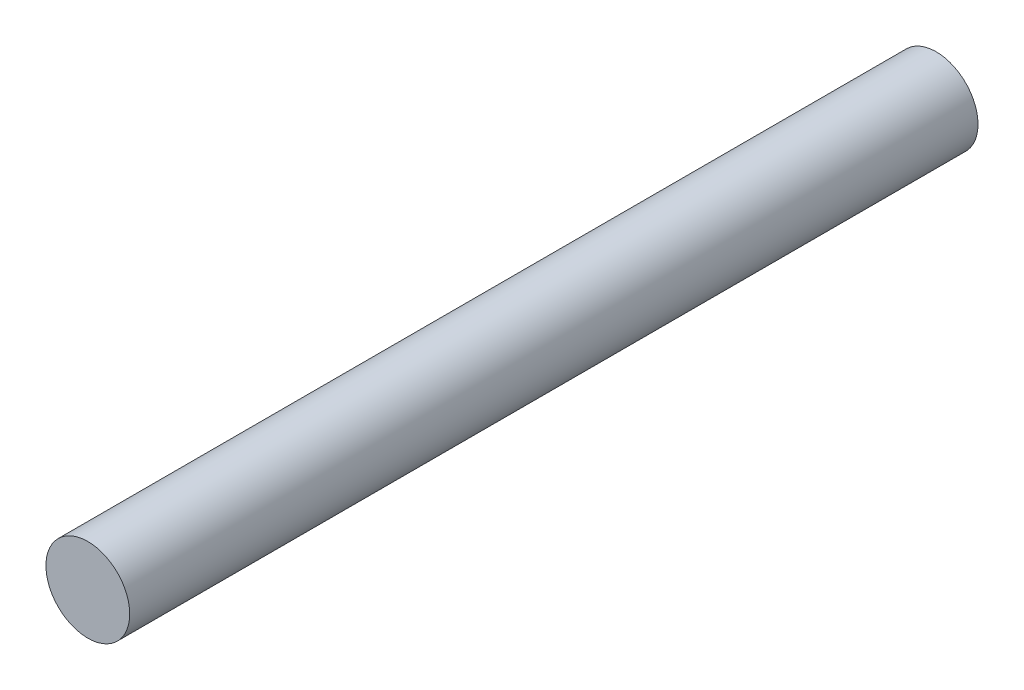
ISO-10303-21;
HEADER;
FILE_DESCRIPTION(('STEP AP214'),'2;1');
FILE_NAME('part.step','',(''),(''),'','','');
FILE_SCHEMA(('AUTOMOTIVE_DESIGN { 1 0 10303 214 1 1 1 1 }'));
ENDSEC;
DATA;
#1=APPLICATION_CONTEXT('core data for automotive mechanical design processes');
#2=APPLICATION_PROTOCOL_DEFINITION('international standard','automotive_design',2000,#1);
#3=PRODUCT_CONTEXT('',#1,'mechanical');
#4=PRODUCT('Part','Part','',(#3));
#5=PRODUCT_RELATED_PRODUCT_CATEGORY('part','',(#4));
#6=PRODUCT_DEFINITION_FORMATION('','',#4);
#7=PRODUCT_DEFINITION_CONTEXT('part definition',#1,'design');
#8=PRODUCT_DEFINITION('design','',#6,#7);
#9=PRODUCT_DEFINITION_SHAPE('','',#8);
#10=(LENGTH_UNIT() NAMED_UNIT(*) SI_UNIT(.MILLI.,.METRE.));
#11=(NAMED_UNIT(*) PLANE_ANGLE_UNIT() SI_UNIT($,.RADIAN.));
#12=(NAMED_UNIT(*) SI_UNIT($,.STERADIAN.) SOLID_ANGLE_UNIT());
#13=UNCERTAINTY_MEASURE_WITH_UNIT(LENGTH_MEASURE(1.E-05),#10,'distance_accuracy_value','');
#14=(GEOMETRIC_REPRESENTATION_CONTEXT(3) GLOBAL_UNCERTAINTY_ASSIGNED_CONTEXT((#13)) GLOBAL_UNIT_ASSIGNED_CONTEXT((#10,
#11,#12)) REPRESENTATION_CONTEXT('',''));
#15=CARTESIAN_POINT('',(0.,0.,0.));
#16=DIRECTION('',(0.,0.,1.));
#17=DIRECTION('',(1.,0.,0.));
#18=AXIS2_PLACEMENT_3D('',#15,#16,#17);
#19=CARTESIAN_POINT('',(0.,0.,162.));
#20=DIRECTION('',(0.,0.,-1.));
#21=DIRECTION('',(-1.,0.,0.));
#22=AXIS2_PLACEMENT_3D('',#19,#20,#21);
#23=CYLINDRICAL_SURFACE('',#22,8.);
#24=CARTESIAN_POINT('',(0.,0.,162.));
#25=DIRECTION('',(0.,0.,1.));
#26=DIRECTION('',(1.,0.,0.));
#27=AXIS2_PLACEMENT_3D('',#24,#25,#26);
#28=CIRCLE('',#27,8.);
#29=CARTESIAN_POINT('',(8.,0.,162.));
#30=VERTEX_POINT('',#29);
#31=EDGE_CURVE('E10',#30,#30,#28,.T.);
#32=ORIENTED_EDGE('',*,*,#31,.F.);
#33=EDGE_LOOP('',(#32));
#34=FACE_BOUND('',#33,.T.);
#35=CARTESIAN_POINT('',(0.,0.,0.));
#36=DIRECTION('',(0.,0.,1.));
#37=DIRECTION('',(1.,0.,0.));
#38=AXIS2_PLACEMENT_3D('',#35,#36,#37);
#39=CIRCLE('',#38,8.);
#40=CARTESIAN_POINT('',(8.,0.,0.));
#41=VERTEX_POINT('',#40);
#42=EDGE_CURVE('E42',#41,#41,#39,.T.);
#43=ORIENTED_EDGE('',*,*,#42,.T.);
#44=EDGE_LOOP('',(#43));
#45=FACE_BOUND('',#44,.T.);
#46=ADVANCED_FACE('F39',(#34,#45),#23,.T.);
#47=CARTESIAN_POINT('',(0.,0.,162.));
#48=DIRECTION('',(0.,0.,1.));
#49=DIRECTION('',(1.,0.,0.));
#50=AXIS2_PLACEMENT_3D('',#47,#48,#49);
#51=PLANE('',#50);
#52=ORIENTED_EDGE('',*,*,#31,.T.);
#53=EDGE_LOOP('',(#52));
#54=FACE_BOUND('',#53,.T.);
#55=ADVANCED_FACE('F54',(#54),#51,.T.);
#56=CARTESIAN_POINT('',(0.,0.,0.));
#57=DIRECTION('',(0.,0.,1.));
#58=DIRECTION('',(1.,0.,0.));
#59=AXIS2_PLACEMENT_3D('',#56,#57,#58);
#60=PLANE('',#59);
#61=ORIENTED_EDGE('',*,*,#42,.F.);
#62=EDGE_LOOP('',(#61));
#63=FACE_BOUND('',#62,.T.);
#64=ADVANCED_FACE('F52',(#63),#60,.F.);
#65=CLOSED_SHELL('',(#46,#55,#64));
#66=MANIFOLD_SOLID_BREP('B2',#65);
#67=ADVANCED_BREP_SHAPE_REPRESENTATION('',(#18,#66),#14);
#68=SHAPE_DEFINITION_REPRESENTATION(#9,#67);
ENDSEC;
END-ISO-10303-21;
